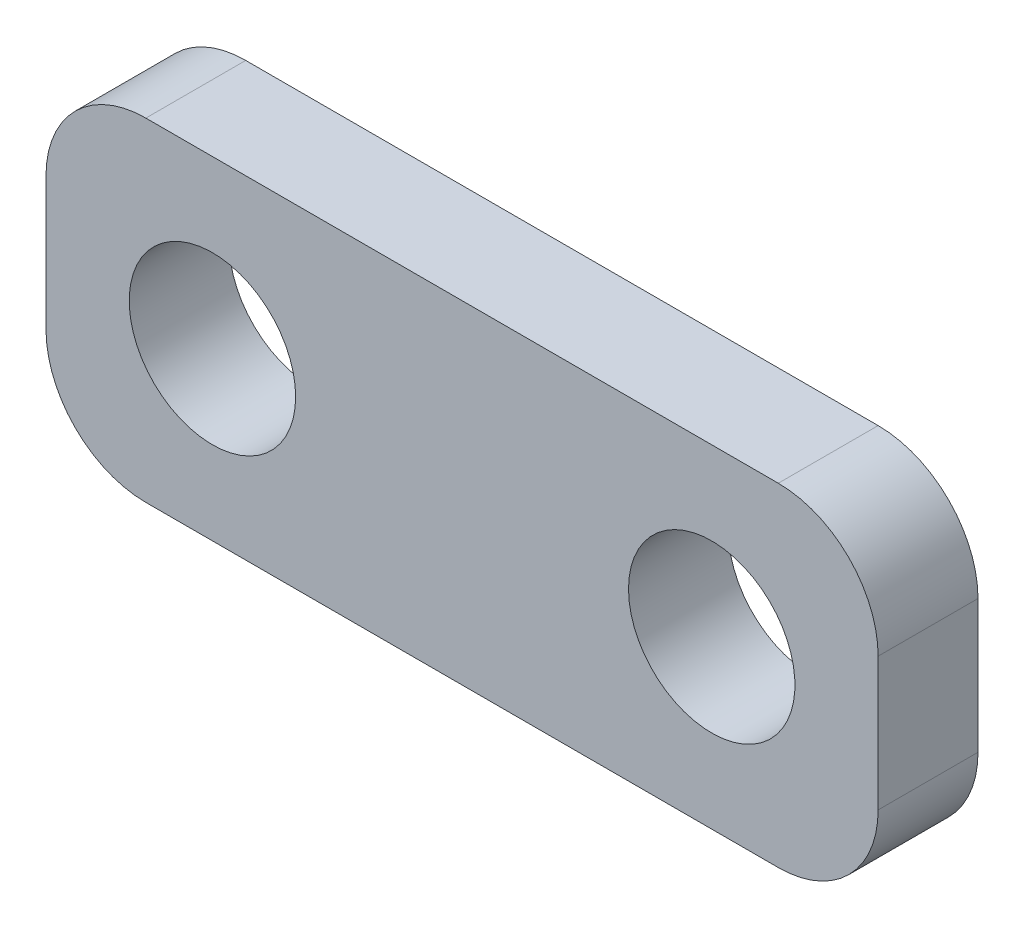
ISO-10303-21;
HEADER;
FILE_DESCRIPTION(('STEP AP214'),'2;1');
FILE_NAME('part.step','',(''),(''),'','','');
FILE_SCHEMA(('AUTOMOTIVE_DESIGN { 1 0 10303 214 1 1 1 1 }'));
ENDSEC;
DATA;
#1=APPLICATION_CONTEXT('core data for automotive mechanical design processes');
#2=APPLICATION_PROTOCOL_DEFINITION('international standard','automotive_design',2000,#1);
#3=PRODUCT_CONTEXT('',#1,'mechanical');
#4=PRODUCT('Part','Part','',(#3));
#5=PRODUCT_RELATED_PRODUCT_CATEGORY('part','',(#4));
#6=PRODUCT_DEFINITION_FORMATION('','',#4);
#7=PRODUCT_DEFINITION_CONTEXT('part definition',#1,'design');
#8=PRODUCT_DEFINITION('design','',#6,#7);
#9=PRODUCT_DEFINITION_SHAPE('','',#8);
#10=(LENGTH_UNIT() NAMED_UNIT(*) SI_UNIT(.MILLI.,.METRE.));
#11=(NAMED_UNIT(*) PLANE_ANGLE_UNIT() SI_UNIT($,.RADIAN.));
#12=(NAMED_UNIT(*) SI_UNIT($,.STERADIAN.) SOLID_ANGLE_UNIT());
#13=UNCERTAINTY_MEASURE_WITH_UNIT(LENGTH_MEASURE(1.E-05),#10,'distance_accuracy_value','');
#14=(GEOMETRIC_REPRESENTATION_CONTEXT(3) GLOBAL_UNCERTAINTY_ASSIGNED_CONTEXT((#13)) GLOBAL_UNIT_ASSIGNED_CONTEXT((#10,
#11,#12)) REPRESENTATION_CONTEXT('',''));
#15=CARTESIAN_POINT('',(0.,0.,0.));
#16=DIRECTION('',(0.,0.,1.));
#17=DIRECTION('',(1.,0.,0.));
#18=AXIS2_PLACEMENT_3D('',#15,#16,#17);
#19=CARTESIAN_POINT('',(0.,0.,3.));
#20=DIRECTION('',(0.,0.,-1.));
#21=DIRECTION('',(-1.,0.,0.));
#22=AXIS2_PLACEMENT_3D('',#19,#20,#21);
#23=PLANE('',#22);
#24=DIRECTION('',(0.,-1.,0.));
#25=VECTOR('',#24,1.);
#26=CARTESIAN_POINT('',(-12.5,-5.,3.));
#27=LINE('',#26,#25);
#28=CARTESIAN_POINT('',(-12.5,2.,3.));
#29=VERTEX_POINT('',#28);
#30=CARTESIAN_POINT('',(-12.5,-2.,3.));
#31=VERTEX_POINT('',#30);
#32=EDGE_CURVE('E176',#29,#31,#27,.T.);
#33=ORIENTED_EDGE('',*,*,#32,.T.);
#34=CARTESIAN_POINT('',(-9.5,-2.,3.));
#35=DIRECTION('',(0.,0.,-1.));
#36=DIRECTION('',(-1.,0.,0.));
#37=AXIS2_PLACEMENT_3D('',#34,#35,#36);
#38=CIRCLE('',#37,3.);
#39=CARTESIAN_POINT('',(-9.5,-5.,3.));
#40=VERTEX_POINT('',#39);
#41=EDGE_CURVE('E153',#31,#40,#38,.F.);
#42=ORIENTED_EDGE('',*,*,#41,.T.);
#43=DIRECTION('',(1.,0.,0.));
#44=VECTOR('',#43,1.);
#45=CARTESIAN_POINT('',(-12.5,-5.,3.));
#46=LINE('',#45,#44);
#47=CARTESIAN_POINT('',(9.50000000000001,-5.,3.));
#48=VERTEX_POINT('',#47);
#49=EDGE_CURVE('E124',#40,#48,#46,.T.);
#50=ORIENTED_EDGE('',*,*,#49,.T.);
#51=CARTESIAN_POINT('',(9.50000000000001,-2.,3.));
#52=DIRECTION('',(0.,0.,-1.));
#53=DIRECTION('',(-1.,0.,0.));
#54=AXIS2_PLACEMENT_3D('',#51,#52,#53);
#55=CIRCLE('',#54,3.);
#56=CARTESIAN_POINT('',(12.5,-2.,3.));
#57=VERTEX_POINT('',#56);
#58=EDGE_CURVE('E151',#48,#57,#55,.F.);
#59=ORIENTED_EDGE('',*,*,#58,.T.);
#60=DIRECTION('',(0.,1.,0.));
#61=VECTOR('',#60,1.);
#62=CARTESIAN_POINT('',(12.5,-5.,3.));
#63=LINE('',#62,#61);
#64=CARTESIAN_POINT('',(12.5,2.,3.));
#65=VERTEX_POINT('',#64);
#66=EDGE_CURVE('E131',#57,#65,#63,.T.);
#67=ORIENTED_EDGE('',*,*,#66,.T.);
#68=CARTESIAN_POINT('',(9.50000000000001,2.,3.));
#69=DIRECTION('',(0.,0.,-1.));
#70=DIRECTION('',(-1.,0.,0.));
#71=AXIS2_PLACEMENT_3D('',#68,#69,#70);
#72=CIRCLE('',#71,3.);
#73=CARTESIAN_POINT('',(9.50000000000001,5.,3.));
#74=VERTEX_POINT('',#73);
#75=EDGE_CURVE('E59',#65,#74,#72,.F.);
#76=ORIENTED_EDGE('',*,*,#75,.T.);
#77=DIRECTION('',(-1.,0.,0.));
#78=VECTOR('',#77,1.);
#79=CARTESIAN_POINT('',(-12.5,5.,3.));
#80=LINE('',#79,#78);
#81=CARTESIAN_POINT('',(-9.5,5.,3.));
#82=VERTEX_POINT('',#81);
#83=EDGE_CURVE('E134',#74,#82,#80,.T.);
#84=ORIENTED_EDGE('',*,*,#83,.T.);
#85=CARTESIAN_POINT('',(-9.5,2.,3.));
#86=DIRECTION('',(0.,0.,-1.));
#87=DIRECTION('',(-1.,0.,0.));
#88=AXIS2_PLACEMENT_3D('',#85,#86,#87);
#89=CIRCLE('',#88,3.);
#90=EDGE_CURVE('E148',#82,#29,#89,.F.);
#91=ORIENTED_EDGE('',*,*,#90,.T.);
#92=EDGE_LOOP('',(#33,#42,#50,#59,#67,#76,#84,#91));
#93=FACE_BOUND('',#92,.T.);
#94=CARTESIAN_POINT('',(-7.5,0.,3.));
#95=DIRECTION('',(0.,0.,1.));
#96=DIRECTION('',(1.,0.,0.));
#97=AXIS2_PLACEMENT_3D('',#94,#95,#96);
#98=CIRCLE('',#97,2.5);
#99=CARTESIAN_POINT('',(-5.,0.,3.));
#100=VERTEX_POINT('',#99);
#101=EDGE_CURVE('E169',#100,#100,#98,.T.);
#102=ORIENTED_EDGE('',*,*,#101,.F.);
#103=EDGE_LOOP('',(#102));
#104=FACE_BOUND('',#103,.T.);
#105=CARTESIAN_POINT('',(7.50000000000001,0.,3.));
#106=DIRECTION('',(0.,0.,1.));
#107=DIRECTION('',(-1.,0.,0.));
#108=AXIS2_PLACEMENT_3D('',#105,#106,#107);
#109=CIRCLE('',#108,2.5);
#110=CARTESIAN_POINT('',(5.00000000000001,0.,3.));
#111=VERTEX_POINT('',#110);
#112=EDGE_CURVE('E181',#111,#111,#109,.T.);
#113=ORIENTED_EDGE('',*,*,#112,.F.);
#114=EDGE_LOOP('',(#113));
#115=FACE_BOUND('',#114,.T.);
#116=ADVANCED_FACE('F38',(#93,#104,#115),#23,.F.);
#117=CARTESIAN_POINT('',(0.,0.,0.));
#118=DIRECTION('',(0.,0.,-1.));
#119=DIRECTION('',(-1.,0.,0.));
#120=AXIS2_PLACEMENT_3D('',#117,#118,#119);
#121=PLANE('',#120);
#122=CARTESIAN_POINT('',(-7.5,0.,0.));
#123=DIRECTION('',(0.,0.,1.));
#124=DIRECTION('',(1.,0.,0.));
#125=AXIS2_PLACEMENT_3D('',#122,#123,#124);
#126=CIRCLE('',#125,2.5);
#127=CARTESIAN_POINT('',(-5.,0.,0.));
#128=VERTEX_POINT('',#127);
#129=EDGE_CURVE('E172',#128,#128,#126,.T.);
#130=ORIENTED_EDGE('',*,*,#129,.T.);
#131=EDGE_LOOP('',(#130));
#132=FACE_BOUND('',#131,.T.);
#133=DIRECTION('',(1.,0.,0.));
#134=VECTOR('',#133,1.);
#135=CARTESIAN_POINT('',(-12.5,-5.,0.));
#136=LINE('',#135,#134);
#137=CARTESIAN_POINT('',(-9.5,-5.,0.));
#138=VERTEX_POINT('',#137);
#139=CARTESIAN_POINT('',(9.50000000000001,-5.,0.));
#140=VERTEX_POINT('',#139);
#141=EDGE_CURVE('E121',#138,#140,#136,.T.);
#142=ORIENTED_EDGE('',*,*,#141,.F.);
#143=CARTESIAN_POINT('',(-9.5,-2.,0.));
#144=DIRECTION('',(0.,0.,-1.));
#145=DIRECTION('',(-1.,0.,0.));
#146=AXIS2_PLACEMENT_3D('',#143,#144,#145);
#147=CIRCLE('',#146,3.);
#148=CARTESIAN_POINT('',(-12.5,-2.,0.));
#149=VERTEX_POINT('',#148);
#150=EDGE_CURVE('E104',#138,#149,#147,.T.);
#151=ORIENTED_EDGE('',*,*,#150,.T.);
#152=DIRECTION('',(0.,-1.,0.));
#153=VECTOR('',#152,1.);
#154=CARTESIAN_POINT('',(-12.5,-5.,0.));
#155=LINE('',#154,#153);
#156=CARTESIAN_POINT('',(-12.5,2.,0.));
#157=VERTEX_POINT('',#156);
#158=EDGE_CURVE('E132',#157,#149,#155,.T.);
#159=ORIENTED_EDGE('',*,*,#158,.F.);
#160=CARTESIAN_POINT('',(-9.5,2.,0.));
#161=DIRECTION('',(0.,0.,-1.));
#162=DIRECTION('',(-1.,0.,0.));
#163=AXIS2_PLACEMENT_3D('',#160,#161,#162);
#164=CIRCLE('',#163,3.);
#165=CARTESIAN_POINT('',(-9.5,5.,0.));
#166=VERTEX_POINT('',#165);
#167=EDGE_CURVE('E125',#157,#166,#164,.T.);
#168=ORIENTED_EDGE('',*,*,#167,.T.);
#169=DIRECTION('',(-1.,0.,0.));
#170=VECTOR('',#169,1.);
#171=CARTESIAN_POINT('',(-12.5,5.,0.));
#172=LINE('',#171,#170);
#173=CARTESIAN_POINT('',(9.50000000000001,5.,0.));
#174=VERTEX_POINT('',#173);
#175=EDGE_CURVE('E136',#174,#166,#172,.T.);
#176=ORIENTED_EDGE('',*,*,#175,.F.);
#177=CARTESIAN_POINT('',(9.50000000000001,2.,0.));
#178=DIRECTION('',(0.,0.,-1.));
#179=DIRECTION('',(-1.,0.,0.));
#180=AXIS2_PLACEMENT_3D('',#177,#178,#179);
#181=CIRCLE('',#180,3.);
#182=CARTESIAN_POINT('',(12.5,2.,0.));
#183=VERTEX_POINT('',#182);
#184=EDGE_CURVE('E142',#174,#183,#181,.T.);
#185=ORIENTED_EDGE('',*,*,#184,.T.);
#186=DIRECTION('',(0.,1.,0.));
#187=VECTOR('',#186,1.);
#188=CARTESIAN_POINT('',(12.5,-5.,0.));
#189=LINE('',#188,#187);
#190=CARTESIAN_POINT('',(12.5,-2.,0.));
#191=VERTEX_POINT('',#190);
#192=EDGE_CURVE('E164',#191,#183,#189,.T.);
#193=ORIENTED_EDGE('',*,*,#192,.F.);
#194=CARTESIAN_POINT('',(9.50000000000001,-2.,0.));
#195=DIRECTION('',(0.,0.,-1.));
#196=DIRECTION('',(-1.,0.,0.));
#197=AXIS2_PLACEMENT_3D('',#194,#195,#196);
#198=CIRCLE('',#197,3.);
#199=EDGE_CURVE('E115',#191,#140,#198,.T.);
#200=ORIENTED_EDGE('',*,*,#199,.T.);
#201=EDGE_LOOP('',(#142,#151,#159,#168,#176,#185,#193,#200));
#202=FACE_BOUND('',#201,.T.);
#203=CARTESIAN_POINT('',(7.50000000000001,0.,0.));
#204=DIRECTION('',(0.,0.,1.));
#205=DIRECTION('',(-1.,0.,0.));
#206=AXIS2_PLACEMENT_3D('',#203,#204,#205);
#207=CIRCLE('',#206,2.5);
#208=CARTESIAN_POINT('',(5.00000000000001,0.,0.));
#209=VERTEX_POINT('',#208);
#210=EDGE_CURVE('E183',#209,#209,#207,.T.);
#211=ORIENTED_EDGE('',*,*,#210,.T.);
#212=EDGE_LOOP('',(#211));
#213=FACE_BOUND('',#212,.T.);
#214=ADVANCED_FACE('F128',(#132,#202,#213),#121,.T.);
#215=CARTESIAN_POINT('',(12.5,-5.,3.));
#216=DIRECTION('',(-1.,0.,0.));
#217=DIRECTION('',(0.,0.,1.));
#218=AXIS2_PLACEMENT_3D('',#215,#216,#217);
#219=PLANE('',#218);
#220=ORIENTED_EDGE('',*,*,#66,.F.);
#221=DIRECTION('',(0.,0.,-1.));
#222=VECTOR('',#221,1.);
#223=CARTESIAN_POINT('',(12.5,-2.,3.));
#224=LINE('',#223,#222);
#225=EDGE_CURVE('E157',#57,#191,#224,.T.);
#226=ORIENTED_EDGE('',*,*,#225,.T.);
#227=ORIENTED_EDGE('',*,*,#192,.T.);
#228=DIRECTION('',(0.,0.,-1.));
#229=VECTOR('',#228,1.);
#230=CARTESIAN_POINT('',(12.5,2.,3.));
#231=LINE('',#230,#229);
#232=EDGE_CURVE('E155',#183,#65,#231,.F.);
#233=ORIENTED_EDGE('',*,*,#232,.T.);
#234=EDGE_LOOP('',(#220,#226,#227,#233));
#235=FACE_BOUND('',#234,.T.);
#236=ADVANCED_FACE('F163',(#235),#219,.F.);
#237=CARTESIAN_POINT('',(-12.5,5.,3.));
#238=DIRECTION('',(0.,-1.,0.));
#239=DIRECTION('',(0.,0.,-1.));
#240=AXIS2_PLACEMENT_3D('',#237,#238,#239);
#241=PLANE('',#240);
#242=ORIENTED_EDGE('',*,*,#83,.F.);
#243=DIRECTION('',(0.,0.,-1.));
#244=VECTOR('',#243,1.);
#245=CARTESIAN_POINT('',(9.50000000000001,5.,3.));
#246=LINE('',#245,#244);
#247=EDGE_CURVE('E11',#74,#174,#246,.T.);
#248=ORIENTED_EDGE('',*,*,#247,.T.);
#249=ORIENTED_EDGE('',*,*,#175,.T.);
#250=DIRECTION('',(0.,0.,-1.));
#251=VECTOR('',#250,1.);
#252=CARTESIAN_POINT('',(-9.5,5.,3.));
#253=LINE('',#252,#251);
#254=EDGE_CURVE('E46',#166,#82,#253,.F.);
#255=ORIENTED_EDGE('',*,*,#254,.T.);
#256=EDGE_LOOP('',(#242,#248,#249,#255));
#257=FACE_BOUND('',#256,.T.);
#258=ADVANCED_FACE('F209',(#257),#241,.F.);
#259=CARTESIAN_POINT('',(-12.5,-5.,3.));
#260=DIRECTION('',(1.,0.,0.));
#261=DIRECTION('',(0.,0.,-1.));
#262=AXIS2_PLACEMENT_3D('',#259,#260,#261);
#263=PLANE('',#262);
#264=ORIENTED_EDGE('',*,*,#158,.T.);
#265=DIRECTION('',(0.,0.,-1.));
#266=VECTOR('',#265,1.);
#267=CARTESIAN_POINT('',(-12.5,-2.,3.));
#268=LINE('',#267,#266);
#269=EDGE_CURVE('E109',#149,#31,#268,.F.);
#270=ORIENTED_EDGE('',*,*,#269,.T.);
#271=ORIENTED_EDGE('',*,*,#32,.F.);
#272=DIRECTION('',(0.,0.,-1.));
#273=VECTOR('',#272,1.);
#274=CARTESIAN_POINT('',(-12.5,2.,3.));
#275=LINE('',#274,#273);
#276=EDGE_CURVE('E114',#29,#157,#275,.T.);
#277=ORIENTED_EDGE('',*,*,#276,.T.);
#278=EDGE_LOOP('',(#264,#270,#271,#277));
#279=FACE_BOUND('',#278,.T.);
#280=ADVANCED_FACE('F206',(#279),#263,.F.);
#281=CARTESIAN_POINT('',(-12.5,-5.,3.));
#282=DIRECTION('',(0.,1.,0.));
#283=DIRECTION('',(0.,0.,1.));
#284=AXIS2_PLACEMENT_3D('',#281,#282,#283);
#285=PLANE('',#284);
#286=ORIENTED_EDGE('',*,*,#49,.F.);
#287=DIRECTION('',(0.,0.,-1.));
#288=VECTOR('',#287,1.);
#289=CARTESIAN_POINT('',(-9.5,-5.,3.));
#290=LINE('',#289,#288);
#291=EDGE_CURVE('E108',#40,#138,#290,.T.);
#292=ORIENTED_EDGE('',*,*,#291,.T.);
#293=ORIENTED_EDGE('',*,*,#141,.T.);
#294=DIRECTION('',(0.,0.,-1.));
#295=VECTOR('',#294,1.);
#296=CARTESIAN_POINT('',(9.50000000000001,-5.,3.));
#297=LINE('',#296,#295);
#298=EDGE_CURVE('E126',#140,#48,#297,.F.);
#299=ORIENTED_EDGE('',*,*,#298,.T.);
#300=EDGE_LOOP('',(#286,#292,#293,#299));
#301=FACE_BOUND('',#300,.T.);
#302=ADVANCED_FACE('F120',(#301),#285,.F.);
#303=CARTESIAN_POINT('',(-7.5,0.,3.));
#304=DIRECTION('',(0.,0.,-1.));
#305=DIRECTION('',(-1.,0.,0.));
#306=AXIS2_PLACEMENT_3D('',#303,#304,#305);
#307=CYLINDRICAL_SURFACE('',#306,2.5);
#308=ORIENTED_EDGE('',*,*,#101,.T.);
#309=EDGE_LOOP('',(#308));
#310=FACE_BOUND('',#309,.T.);
#311=ORIENTED_EDGE('',*,*,#129,.F.);
#312=EDGE_LOOP('',(#311));
#313=FACE_BOUND('',#312,.T.);
#314=ADVANCED_FACE('F201',(#310,#313),#307,.F.);
#315=CARTESIAN_POINT('',(7.50000000000001,0.,3.));
#316=DIRECTION('',(0.,0.,-1.));
#317=DIRECTION('',(-1.,0.,0.));
#318=AXIS2_PLACEMENT_3D('',#315,#316,#317);
#319=CYLINDRICAL_SURFACE('',#318,2.5);
#320=ORIENTED_EDGE('',*,*,#112,.T.);
#321=EDGE_LOOP('',(#320));
#322=FACE_BOUND('',#321,.T.);
#323=ORIENTED_EDGE('',*,*,#210,.F.);
#324=EDGE_LOOP('',(#323));
#325=FACE_BOUND('',#324,.T.);
#326=ADVANCED_FACE('F189',(#322,#325),#319,.F.);
#327=CARTESIAN_POINT('',(-9.5,-2.,3.));
#328=DIRECTION('',(0.,0.,-1.));
#329=DIRECTION('',(-1.,0.,0.));
#330=AXIS2_PLACEMENT_3D('',#327,#328,#329);
#331=CYLINDRICAL_SURFACE('',#330,3.);
#332=ORIENTED_EDGE('',*,*,#41,.F.);
#333=ORIENTED_EDGE('',*,*,#269,.F.);
#334=ORIENTED_EDGE('',*,*,#150,.F.);
#335=ORIENTED_EDGE('',*,*,#291,.F.);
#336=EDGE_LOOP('',(#332,#333,#334,#335));
#337=FACE_BOUND('',#336,.T.);
#338=ADVANCED_FACE('F107',(#337),#331,.T.);
#339=CARTESIAN_POINT('',(9.50000000000001,-2.,3.));
#340=DIRECTION('',(0.,0.,-1.));
#341=DIRECTION('',(-1.,0.,0.));
#342=AXIS2_PLACEMENT_3D('',#339,#340,#341);
#343=CYLINDRICAL_SURFACE('',#342,3.);
#344=ORIENTED_EDGE('',*,*,#58,.F.);
#345=ORIENTED_EDGE('',*,*,#298,.F.);
#346=ORIENTED_EDGE('',*,*,#199,.F.);
#347=ORIENTED_EDGE('',*,*,#225,.F.);
#348=EDGE_LOOP('',(#344,#345,#346,#347));
#349=FACE_BOUND('',#348,.T.);
#350=ADVANCED_FACE('F217',(#349),#343,.T.);
#351=CARTESIAN_POINT('',(9.50000000000001,2.,3.));
#352=DIRECTION('',(0.,0.,-1.));
#353=DIRECTION('',(-1.,0.,0.));
#354=AXIS2_PLACEMENT_3D('',#351,#352,#353);
#355=CYLINDRICAL_SURFACE('',#354,3.);
#356=ORIENTED_EDGE('',*,*,#75,.F.);
#357=ORIENTED_EDGE('',*,*,#232,.F.);
#358=ORIENTED_EDGE('',*,*,#184,.F.);
#359=ORIENTED_EDGE('',*,*,#247,.F.);
#360=EDGE_LOOP('',(#356,#357,#358,#359));
#361=FACE_BOUND('',#360,.T.);
#362=ADVANCED_FACE('F219',(#361),#355,.T.);
#363=CARTESIAN_POINT('',(-9.5,2.,3.));
#364=DIRECTION('',(0.,0.,-1.));
#365=DIRECTION('',(-1.,0.,0.));
#366=AXIS2_PLACEMENT_3D('',#363,#364,#365);
#367=CYLINDRICAL_SURFACE('',#366,3.);
#368=ORIENTED_EDGE('',*,*,#90,.F.);
#369=ORIENTED_EDGE('',*,*,#254,.F.);
#370=ORIENTED_EDGE('',*,*,#167,.F.);
#371=ORIENTED_EDGE('',*,*,#276,.F.);
#372=EDGE_LOOP('',(#368,#369,#370,#371));
#373=FACE_BOUND('',#372,.T.);
#374=ADVANCED_FACE('F40',(#373),#367,.T.);
#375=CLOSED_SHELL('',(#116,#214,#236,#258,#280,#302,#314,#326,#338,#350,#362,#374));
#376=MANIFOLD_SOLID_BREP('B2',#375);
#377=ADVANCED_BREP_SHAPE_REPRESENTATION('',(#18,#376),#14);
#378=SHAPE_DEFINITION_REPRESENTATION(#9,#377);
ENDSEC;
END-ISO-10303-21;
